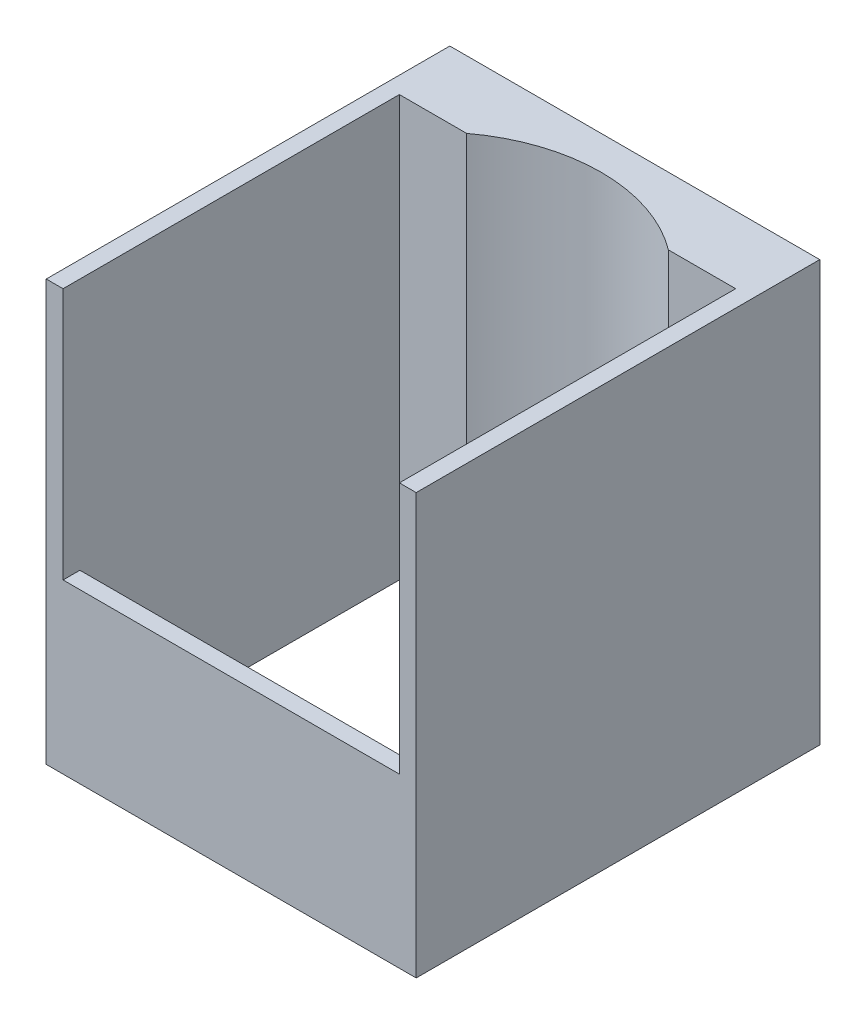
ISO-10303-21;
HEADER;
FILE_DESCRIPTION(('STEP AP214'),'2;1');
FILE_NAME('part.step','',(''),(''),'','','');
FILE_SCHEMA(('AUTOMOTIVE_DESIGN { 1 0 10303 214 1 1 1 1 }'));
ENDSEC;
DATA;
#1=APPLICATION_CONTEXT('core data for automotive mechanical design processes');
#2=APPLICATION_PROTOCOL_DEFINITION('international standard','automotive_design',2000,#1);
#3=PRODUCT_CONTEXT('',#1,'mechanical');
#4=PRODUCT('Part','Part','',(#3));
#5=PRODUCT_RELATED_PRODUCT_CATEGORY('part','',(#4));
#6=PRODUCT_DEFINITION_FORMATION('','',#4);
#7=PRODUCT_DEFINITION_CONTEXT('part definition',#1,'design');
#8=PRODUCT_DEFINITION('design','',#6,#7);
#9=PRODUCT_DEFINITION_SHAPE('','',#8);
#10=(LENGTH_UNIT() NAMED_UNIT(*) SI_UNIT(.MILLI.,.METRE.));
#11=(NAMED_UNIT(*) PLANE_ANGLE_UNIT() SI_UNIT($,.RADIAN.));
#12=(NAMED_UNIT(*) SI_UNIT($,.STERADIAN.) SOLID_ANGLE_UNIT());
#13=UNCERTAINTY_MEASURE_WITH_UNIT(LENGTH_MEASURE(1.E-05),#10,'distance_accuracy_value','');
#14=(GEOMETRIC_REPRESENTATION_CONTEXT(3) GLOBAL_UNCERTAINTY_ASSIGNED_CONTEXT((#13)) GLOBAL_UNIT_ASSIGNED_CONTEXT((#10,
#11,#12)) REPRESENTATION_CONTEXT('',''));
#15=CARTESIAN_POINT('',(0.,0.,0.));
#16=DIRECTION('',(0.,0.,1.));
#17=DIRECTION('',(1.,0.,0.));
#18=AXIS2_PLACEMENT_3D('',#15,#16,#17);
#19=CARTESIAN_POINT('',(0.,530.,0.));
#20=DIRECTION('',(0.,0.,-1.));
#21=DIRECTION('',(-1.,0.,0.));
#22=AXIS2_PLACEMENT_3D('',#19,#20,#21);
#23=PLANE('',#22);
#24=DIRECTION('',(0.,1.,0.));
#25=VECTOR('',#24,1.);
#26=CARTESIAN_POINT('',(225.,530.,0.));
#27=LINE('',#26,#25);
#28=CARTESIAN_POINT('',(225.,280.,0.));
#29=VERTEX_POINT('',#28);
#30=CARTESIAN_POINT('',(225.,405.,0.));
#31=VERTEX_POINT('',#30);
#32=EDGE_CURVE('E160',#29,#31,#27,.T.);
#33=ORIENTED_EDGE('',*,*,#32,.T.);
#34=DIRECTION('',(-1.,0.,0.));
#35=VECTOR('',#34,1.);
#36=CARTESIAN_POINT('',(0.,405.,0.));
#37=LINE('',#36,#35);
#38=CARTESIAN_POINT('',(220.,405.,0.));
#39=VERTEX_POINT('',#38);
#40=EDGE_CURVE('E129',#31,#39,#37,.T.);
#41=ORIENTED_EDGE('',*,*,#40,.T.);
#42=DIRECTION('',(0.,1.,0.));
#43=VECTOR('',#42,1.);
#44=CARTESIAN_POINT('',(220.,280.,0.));
#45=LINE('',#44,#43);
#46=CARTESIAN_POINT('',(220.,330.,0.));
#47=VERTEX_POINT('',#46);
#48=EDGE_CURVE('E203',#47,#39,#45,.T.);
#49=ORIENTED_EDGE('',*,*,#48,.F.);
#50=DIRECTION('',(-1.,0.,0.));
#51=VECTOR('',#50,1.);
#52=CARTESIAN_POINT('',(9.99999999999982,330.,0.));
#53=LINE('',#52,#51);
#54=CARTESIAN_POINT('',(120.,330.,0.));
#55=VERTEX_POINT('',#54);
#56=EDGE_CURVE('E177',#47,#55,#53,.T.);
#57=ORIENTED_EDGE('',*,*,#56,.T.);
#58=DIRECTION('',(0.,-1.,0.));
#59=VECTOR('',#58,1.);
#60=CARTESIAN_POINT('',(120.,280.,0.));
#61=LINE('',#60,#59);
#62=CARTESIAN_POINT('',(120.,405.,0.));
#63=VERTEX_POINT('',#62);
#64=EDGE_CURVE('E220',#63,#55,#61,.T.);
#65=ORIENTED_EDGE('',*,*,#64,.F.);
#66=CARTESIAN_POINT('',(115.,405.,0.));
#67=VERTEX_POINT('',#66);
#68=EDGE_CURVE('E155',#63,#67,#37,.T.);
#69=ORIENTED_EDGE('',*,*,#68,.T.);
#70=DIRECTION('',(0.,-1.,0.));
#71=VECTOR('',#70,1.);
#72=CARTESIAN_POINT('',(115.,530.,0.));
#73=LINE('',#72,#71);
#74=CARTESIAN_POINT('',(115.,280.,0.));
#75=VERTEX_POINT('',#74);
#76=EDGE_CURVE('E163',#67,#75,#73,.T.);
#77=ORIENTED_EDGE('',*,*,#76,.T.);
#78=DIRECTION('',(-1.,0.,0.));
#79=VECTOR('',#78,1.);
#80=CARTESIAN_POINT('',(0.,280.,0.));
#81=LINE('',#80,#79);
#82=EDGE_CURVE('E166',#29,#75,#81,.T.);
#83=ORIENTED_EDGE('',*,*,#82,.F.);
#84=EDGE_LOOP('',(#33,#41,#49,#57,#65,#69,#77,#83));
#85=FACE_BOUND('',#84,.T.);
#86=ADVANCED_FACE('F38',(#85),#23,.F.);
#87=CARTESIAN_POINT('',(0.,0.,-100.));
#88=DIRECTION('',(0.,0.,1.));
#89=DIRECTION('',(1.,0.,0.));
#90=AXIS2_PLACEMENT_3D('',#87,#88,#89);
#91=PLANE('',#90);
#92=DIRECTION('',(1.,0.,0.));
#93=VECTOR('',#92,1.);
#94=CARTESIAN_POINT('',(0.,405.,-100.));
#95=LINE('',#94,#93);
#96=CARTESIAN_POINT('',(200.,405.,-100.));
#97=VERTEX_POINT('',#96);
#98=CARTESIAN_POINT('',(220.,405.,-100.));
#99=VERTEX_POINT('',#98);
#100=EDGE_CURVE('E272',#97,#99,#95,.T.);
#101=ORIENTED_EDGE('',*,*,#100,.F.);
#102=DIRECTION('',(0.,1.,0.));
#103=VECTOR('',#102,1.);
#104=CARTESIAN_POINT('',(200.,270.,-100.));
#105=LINE('',#104,#103);
#106=CARTESIAN_POINT('',(200.,280.,-100.));
#107=VERTEX_POINT('',#106);
#108=EDGE_CURVE('E11',#107,#97,#105,.T.);
#109=ORIENTED_EDGE('',*,*,#108,.F.);
#110=DIRECTION('',(1.,0.,0.));
#111=VECTOR('',#110,1.);
#112=CARTESIAN_POINT('',(120.,280.,-100.));
#113=LINE('',#112,#111);
#114=CARTESIAN_POINT('',(220.,280.,-100.));
#115=VERTEX_POINT('',#114);
#116=EDGE_CURVE('E209',#107,#115,#113,.T.);
#117=ORIENTED_EDGE('',*,*,#116,.T.);
#118=DIRECTION('',(0.,1.,0.));
#119=VECTOR('',#118,1.);
#120=CARTESIAN_POINT('',(220.,280.,-100.));
#121=LINE('',#120,#119);
#122=EDGE_CURVE('E208',#115,#99,#121,.T.);
#123=ORIENTED_EDGE('',*,*,#122,.T.);
#124=EDGE_LOOP('',(#101,#109,#117,#123));
#125=FACE_BOUND('',#124,.T.);
#126=ADVANCED_FACE('F271',(#125),#91,.T.);
#127=CARTESIAN_POINT('',(0.,530.,-120.));
#128=DIRECTION('',(0.,0.,1.));
#129=DIRECTION('',(1.,0.,0.));
#130=AXIS2_PLACEMENT_3D('',#127,#128,#129);
#131=PLANE('',#130);
#132=DIRECTION('',(0.,1.,0.));
#133=VECTOR('',#132,1.);
#134=CARTESIAN_POINT('',(115.,280.,-120.));
#135=LINE('',#134,#133);
#136=CARTESIAN_POINT('',(115.,280.,-120.));
#137=VERTEX_POINT('',#136);
#138=CARTESIAN_POINT('',(115.,405.,-120.));
#139=VERTEX_POINT('',#138);
#140=EDGE_CURVE('E60',#137,#139,#135,.T.);
#141=ORIENTED_EDGE('',*,*,#140,.T.);
#142=DIRECTION('',(1.,0.,0.));
#143=VECTOR('',#142,1.);
#144=CARTESIAN_POINT('',(115.,405.,-120.));
#145=LINE('',#144,#143);
#146=CARTESIAN_POINT('',(225.,405.,-120.));
#147=VERTEX_POINT('',#146);
#148=EDGE_CURVE('E53',#139,#147,#145,.T.);
#149=ORIENTED_EDGE('',*,*,#148,.T.);
#150=DIRECTION('',(0.,-1.,0.));
#151=VECTOR('',#150,1.);
#152=CARTESIAN_POINT('',(225.,280.,-120.));
#153=LINE('',#152,#151);
#154=CARTESIAN_POINT('',(225.,280.,-120.));
#155=VERTEX_POINT('',#154);
#156=EDGE_CURVE('E140',#147,#155,#153,.T.);
#157=ORIENTED_EDGE('',*,*,#156,.T.);
#158=DIRECTION('',(-1.,0.,0.));
#159=VECTOR('',#158,1.);
#160=CARTESIAN_POINT('',(0.,280.,-120.));
#161=LINE('',#160,#159);
#162=EDGE_CURVE('E174',#155,#137,#161,.T.);
#163=ORIENTED_EDGE('',*,*,#162,.T.);
#164=EDGE_LOOP('',(#141,#149,#157,#163));
#165=FACE_BOUND('',#164,.T.);
#166=ADVANCED_FACE('F138',(#165),#131,.F.);
#167=CARTESIAN_POINT('',(120.,280.,-100.));
#168=DIRECTION('',(-1.,0.,0.));
#169=DIRECTION('',(0.,0.,1.));
#170=AXIS2_PLACEMENT_3D('',#167,#168,#169);
#171=PLANE('',#170);
#172=DIRECTION('',(0.,-1.,0.));
#173=VECTOR('',#172,1.);
#174=CARTESIAN_POINT('',(120.,280.,-100.));
#175=LINE('',#174,#173);
#176=CARTESIAN_POINT('',(120.,405.,-100.));
#177=VERTEX_POINT('',#176);
#178=CARTESIAN_POINT('',(120.,280.,-100.));
#179=VERTEX_POINT('',#178);
#180=EDGE_CURVE('E213',#177,#179,#175,.T.);
#181=ORIENTED_EDGE('',*,*,#180,.F.);
#182=DIRECTION('',(0.,0.,1.));
#183=VECTOR('',#182,1.);
#184=CARTESIAN_POINT('',(120.,405.,-100.));
#185=LINE('',#184,#183);
#186=EDGE_CURVE('E248',#177,#63,#185,.T.);
#187=ORIENTED_EDGE('',*,*,#186,.T.);
#188=ORIENTED_EDGE('',*,*,#64,.T.);
#189=DIRECTION('',(0.,0.,-1.));
#190=VECTOR('',#189,1.);
#191=CARTESIAN_POINT('',(120.,330.,-100.));
#192=LINE('',#191,#190);
#193=CARTESIAN_POINT('',(120.,330.,-5.));
#194=VERTEX_POINT('',#193);
#195=EDGE_CURVE('E200',#55,#194,#192,.T.);
#196=ORIENTED_EDGE('',*,*,#195,.T.);
#197=DIRECTION('',(0.,-1.,0.));
#198=VECTOR('',#197,1.);
#199=CARTESIAN_POINT('',(120.,280.,-5.));
#200=LINE('',#199,#198);
#201=CARTESIAN_POINT('',(120.,280.,-5.));
#202=VERTEX_POINT('',#201);
#203=EDGE_CURVE('E192',#194,#202,#200,.T.);
#204=ORIENTED_EDGE('',*,*,#203,.T.);
#205=DIRECTION('',(0.,0.,1.));
#206=VECTOR('',#205,1.);
#207=CARTESIAN_POINT('',(120.,280.,-100.));
#208=LINE('',#207,#206);
#209=EDGE_CURVE('E223',#179,#202,#208,.T.);
#210=ORIENTED_EDGE('',*,*,#209,.F.);
#211=EDGE_LOOP('',(#181,#187,#188,#196,#204,#210));
#212=FACE_BOUND('',#211,.T.);
#213=ADVANCED_FACE('F247',(#212),#171,.F.);
#214=CARTESIAN_POINT('',(220.,280.,-100.));
#215=DIRECTION('',(1.,0.,0.));
#216=DIRECTION('',(0.,0.,-1.));
#217=AXIS2_PLACEMENT_3D('',#214,#215,#216);
#218=PLANE('',#217);
#219=ORIENTED_EDGE('',*,*,#48,.T.);
#220=DIRECTION('',(0.,0.,-1.));
#221=VECTOR('',#220,1.);
#222=CARTESIAN_POINT('',(220.,405.,-100.));
#223=LINE('',#222,#221);
#224=EDGE_CURVE('E153',#39,#99,#223,.T.);
#225=ORIENTED_EDGE('',*,*,#224,.T.);
#226=ORIENTED_EDGE('',*,*,#122,.F.);
#227=DIRECTION('',(0.,0.,1.));
#228=VECTOR('',#227,1.);
#229=CARTESIAN_POINT('',(220.,280.,-100.));
#230=LINE('',#229,#228);
#231=CARTESIAN_POINT('',(220.,280.,-5.));
#232=VERTEX_POINT('',#231);
#233=EDGE_CURVE('E216',#115,#232,#230,.T.);
#234=ORIENTED_EDGE('',*,*,#233,.T.);
#235=DIRECTION('',(0.,1.,0.));
#236=VECTOR('',#235,1.);
#237=CARTESIAN_POINT('',(220.,280.,-5.));
#238=LINE('',#237,#236);
#239=CARTESIAN_POINT('',(220.,330.,-5.));
#240=VERTEX_POINT('',#239);
#241=EDGE_CURVE('E186',#232,#240,#238,.T.);
#242=ORIENTED_EDGE('',*,*,#241,.T.);
#243=DIRECTION('',(0.,0.,1.));
#244=VECTOR('',#243,1.);
#245=CARTESIAN_POINT('',(220.,330.,-100.));
#246=LINE('',#245,#244);
#247=EDGE_CURVE('E196',#240,#47,#246,.T.);
#248=ORIENTED_EDGE('',*,*,#247,.T.);
#249=EDGE_LOOP('',(#219,#225,#226,#234,#242,#248));
#250=FACE_BOUND('',#249,.T.);
#251=ADVANCED_FACE('F258',(#250),#218,.F.);
#252=DIRECTION('',(1.,0.,0.));
#253=VECTOR('',#252,1.);
#254=CARTESIAN_POINT('',(0.,405.,-100.));
#255=LINE('',#254,#253);
#256=CARTESIAN_POINT('',(140.,405.,-100.));
#257=VERTEX_POINT('',#256);
#258=EDGE_CURVE('E244',#177,#257,#255,.T.);
#259=ORIENTED_EDGE('',*,*,#258,.F.);
#260=ORIENTED_EDGE('',*,*,#180,.T.);
#261=CARTESIAN_POINT('',(140.,280.,-100.));
#262=VERTEX_POINT('',#261);
#263=EDGE_CURVE('E204',#179,#262,#113,.T.);
#264=ORIENTED_EDGE('',*,*,#263,.T.);
#265=DIRECTION('',(0.,1.,0.));
#266=VECTOR('',#265,1.);
#267=CARTESIAN_POINT('',(140.,270.,-100.));
#268=LINE('',#267,#266);
#269=EDGE_CURVE('E46',#257,#262,#268,.F.);
#270=ORIENTED_EDGE('',*,*,#269,.F.);
#271=EDGE_LOOP('',(#259,#260,#264,#270));
#272=FACE_BOUND('',#271,.T.);
#273=ADVANCED_FACE('F242',(#272),#91,.T.);
#274=CARTESIAN_POINT('',(170.,270.,-60.));
#275=DIRECTION('',(0.,1.,0.));
#276=DIRECTION('',(0.,0.,1.));
#277=AXIS2_PLACEMENT_3D('',#274,#275,#276);
#278=CYLINDRICAL_SURFACE('',#277,50.);
#279=ORIENTED_EDGE('',*,*,#108,.T.);
#280=CARTESIAN_POINT('',(170.,405.,-60.));
#281=DIRECTION('',(0.,-1.,0.));
#282=DIRECTION('',(0.,0.,-1.));
#283=AXIS2_PLACEMENT_3D('',#280,#281,#282);
#284=CIRCLE('',#283,50.);
#285=EDGE_CURVE('E134',#97,#257,#284,.F.);
#286=ORIENTED_EDGE('',*,*,#285,.T.);
#287=ORIENTED_EDGE('',*,*,#269,.T.);
#288=CARTESIAN_POINT('',(170.,280.,-60.));
#289=DIRECTION('',(0.,1.,0.));
#290=DIRECTION('',(0.,0.,1.));
#291=AXIS2_PLACEMENT_3D('',#288,#289,#290);
#292=CIRCLE('',#291,50.);
#293=EDGE_CURVE('E170',#262,#107,#292,.F.);
#294=ORIENTED_EDGE('',*,*,#293,.T.);
#295=EDGE_LOOP('',(#279,#286,#287,#294));
#296=FACE_BOUND('',#295,.T.);
#297=ADVANCED_FACE('F232',(#296),#278,.F.);
#298=CARTESIAN_POINT('',(0.,0.,-5.));
#299=DIRECTION('',(0.,0.,-1.));
#300=DIRECTION('',(-1.,0.,0.));
#301=AXIS2_PLACEMENT_3D('',#298,#299,#300);
#302=PLANE('',#301);
#303=ORIENTED_EDGE('',*,*,#203,.F.);
#304=DIRECTION('',(-1.,0.,0.));
#305=VECTOR('',#304,1.);
#306=CARTESIAN_POINT('',(9.99999999999982,330.,-5.));
#307=LINE('',#306,#305);
#308=EDGE_CURVE('E182',#240,#194,#307,.T.);
#309=ORIENTED_EDGE('',*,*,#308,.F.);
#310=ORIENTED_EDGE('',*,*,#241,.F.);
#311=DIRECTION('',(1.,0.,0.));
#312=VECTOR('',#311,1.);
#313=CARTESIAN_POINT('',(9.99999999999982,280.,-5.));
#314=LINE('',#313,#312);
#315=EDGE_CURVE('E178',#202,#232,#314,.T.);
#316=ORIENTED_EDGE('',*,*,#315,.F.);
#317=EDGE_LOOP('',(#303,#309,#310,#316));
#318=FACE_BOUND('',#317,.T.);
#319=ADVANCED_FACE('F255',(#318),#302,.T.);
#320=CARTESIAN_POINT('',(9.99999999999982,330.,-5.));
#321=DIRECTION('',(0.,1.,0.));
#322=DIRECTION('',(0.,0.,1.));
#323=AXIS2_PLACEMENT_3D('',#320,#321,#322);
#324=PLANE('',#323);
#325=ORIENTED_EDGE('',*,*,#195,.F.);
#326=ORIENTED_EDGE('',*,*,#56,.F.);
#327=ORIENTED_EDGE('',*,*,#247,.F.);
#328=ORIENTED_EDGE('',*,*,#308,.T.);
#329=EDGE_LOOP('',(#325,#326,#327,#328));
#330=FACE_BOUND('',#329,.T.);
#331=ADVANCED_FACE('F263',(#330),#324,.T.);
#332=CARTESIAN_POINT('',(0.,280.,-159.));
#333=DIRECTION('',(0.,1.,0.));
#334=DIRECTION('',(0.,0.,1.));
#335=AXIS2_PLACEMENT_3D('',#332,#333,#334);
#336=PLANE('',#335);
#337=ORIENTED_EDGE('',*,*,#263,.F.);
#338=ORIENTED_EDGE('',*,*,#209,.T.);
#339=ORIENTED_EDGE('',*,*,#315,.T.);
#340=ORIENTED_EDGE('',*,*,#233,.F.);
#341=ORIENTED_EDGE('',*,*,#116,.F.);
#342=ORIENTED_EDGE('',*,*,#293,.F.);
#343=EDGE_LOOP('',(#337,#338,#339,#340,#341,#342));
#344=FACE_BOUND('',#343,.T.);
#345=ORIENTED_EDGE('',*,*,#82,.T.);
#346=DIRECTION('',(0.,0.,1.));
#347=VECTOR('',#346,1.);
#348=CARTESIAN_POINT('',(115.,280.,-120.));
#349=LINE('',#348,#347);
#350=EDGE_CURVE('E157',#137,#75,#349,.T.);
#351=ORIENTED_EDGE('',*,*,#350,.F.);
#352=ORIENTED_EDGE('',*,*,#162,.F.);
#353=DIRECTION('',(0.,0.,1.));
#354=VECTOR('',#353,1.);
#355=CARTESIAN_POINT('',(225.,280.,-120.));
#356=LINE('',#355,#354);
#357=EDGE_CURVE('E146',#155,#29,#356,.T.);
#358=ORIENTED_EDGE('',*,*,#357,.T.);
#359=EDGE_LOOP('',(#345,#351,#352,#358));
#360=FACE_BOUND('',#359,.T.);
#361=ADVANCED_FACE('F238',(#344,#360),#336,.F.);
#362=CARTESIAN_POINT('',(225.,280.,-120.));
#363=DIRECTION('',(-1.,0.,0.));
#364=DIRECTION('',(0.,0.,1.));
#365=AXIS2_PLACEMENT_3D('',#362,#363,#364);
#366=PLANE('',#365);
#367=ORIENTED_EDGE('',*,*,#156,.F.);
#368=DIRECTION('',(0.,0.,1.));
#369=VECTOR('',#368,1.);
#370=CARTESIAN_POINT('',(225.,405.,-120.));
#371=LINE('',#370,#369);
#372=EDGE_CURVE('E126',#147,#31,#371,.T.);
#373=ORIENTED_EDGE('',*,*,#372,.T.);
#374=ORIENTED_EDGE('',*,*,#32,.F.);
#375=ORIENTED_EDGE('',*,*,#357,.F.);
#376=EDGE_LOOP('',(#367,#373,#374,#375));
#377=FACE_BOUND('',#376,.T.);
#378=ADVANCED_FACE('F144',(#377),#366,.F.);
#379=CARTESIAN_POINT('',(115.,280.,-120.));
#380=DIRECTION('',(1.,0.,0.));
#381=DIRECTION('',(0.,0.,-1.));
#382=AXIS2_PLACEMENT_3D('',#379,#380,#381);
#383=PLANE('',#382);
#384=ORIENTED_EDGE('',*,*,#76,.F.);
#385=DIRECTION('',(0.,0.,1.));
#386=VECTOR('',#385,1.);
#387=CARTESIAN_POINT('',(115.,405.,-120.));
#388=LINE('',#387,#386);
#389=EDGE_CURVE('E135',#139,#67,#388,.T.);
#390=ORIENTED_EDGE('',*,*,#389,.F.);
#391=ORIENTED_EDGE('',*,*,#140,.F.);
#392=ORIENTED_EDGE('',*,*,#350,.T.);
#393=EDGE_LOOP('',(#384,#390,#391,#392));
#394=FACE_BOUND('',#393,.T.);
#395=ADVANCED_FACE('F289',(#394),#383,.F.);
#396=CARTESIAN_POINT('',(115.,405.,-120.));
#397=DIRECTION('',(0.,-1.,0.));
#398=DIRECTION('',(0.,0.,-1.));
#399=AXIS2_PLACEMENT_3D('',#396,#397,#398);
#400=PLANE('',#399);
#401=ORIENTED_EDGE('',*,*,#372,.F.);
#402=ORIENTED_EDGE('',*,*,#148,.F.);
#403=ORIENTED_EDGE('',*,*,#389,.T.);
#404=ORIENTED_EDGE('',*,*,#68,.F.);
#405=ORIENTED_EDGE('',*,*,#186,.F.);
#406=ORIENTED_EDGE('',*,*,#258,.T.);
#407=ORIENTED_EDGE('',*,*,#285,.F.);
#408=ORIENTED_EDGE('',*,*,#100,.T.);
#409=ORIENTED_EDGE('',*,*,#224,.F.);
#410=ORIENTED_EDGE('',*,*,#40,.F.);
#411=EDGE_LOOP('',(#401,#402,#403,#404,#405,#406,#407,#408,#409,#410));
#412=FACE_BOUND('',#411,.T.);
#413=ADVANCED_FACE('F127',(#412),#400,.F.);
#414=CLOSED_SHELL('',(#86,#126,#166,#213,#251,#273,#297,#319,#331,#361,#378,#395,#413));
#415=MANIFOLD_SOLID_BREP('B2',#414);
#416=ADVANCED_BREP_SHAPE_REPRESENTATION('',(#18,#415),#14);
#417=SHAPE_DEFINITION_REPRESENTATION(#9,#416);
ENDSEC;
END-ISO-10303-21;
